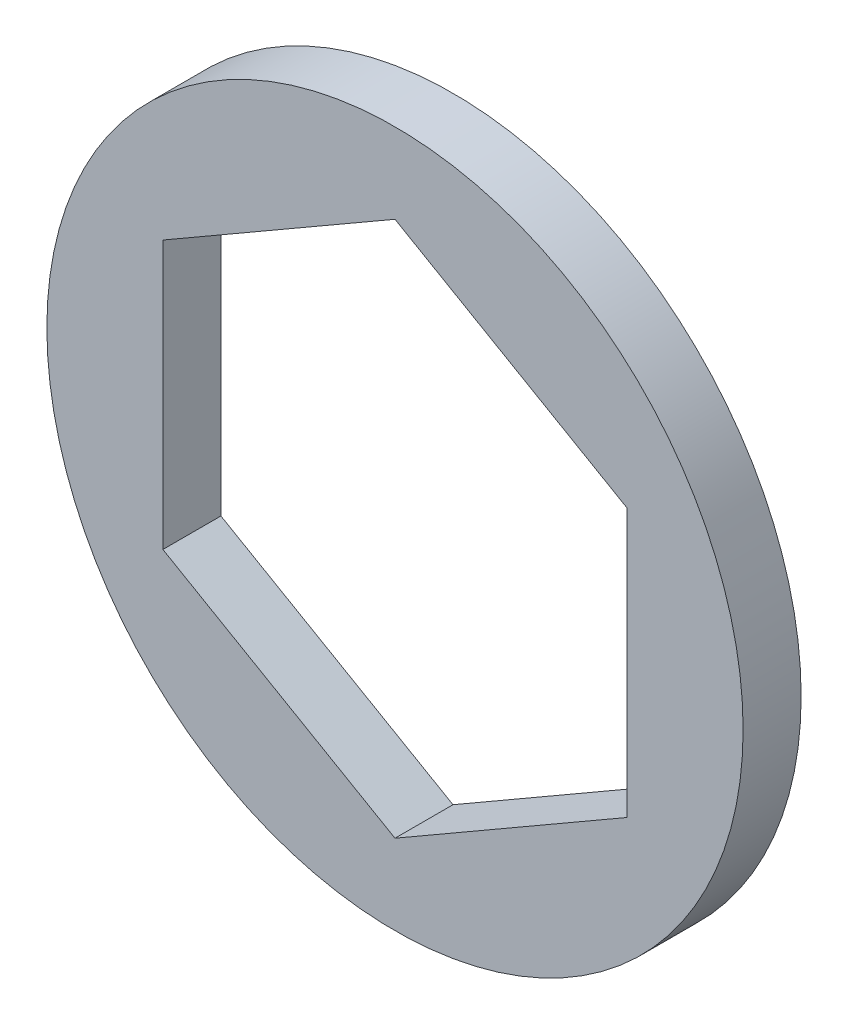
ISO-10303-21;
HEADER;
FILE_DESCRIPTION(('STEP AP214'),'2;1');
FILE_NAME('part.step','',(''),(''),'','','');
FILE_SCHEMA(('AUTOMOTIVE_DESIGN { 1 0 10303 214 1 1 1 1 }'));
ENDSEC;
DATA;
#1=APPLICATION_CONTEXT('core data for automotive mechanical design processes');
#2=APPLICATION_PROTOCOL_DEFINITION('international standard','automotive_design',2000,#1);
#3=PRODUCT_CONTEXT('',#1,'mechanical');
#4=PRODUCT('Part','Part','',(#3));
#5=PRODUCT_RELATED_PRODUCT_CATEGORY('part','',(#4));
#6=PRODUCT_DEFINITION_FORMATION('','',#4);
#7=PRODUCT_DEFINITION_CONTEXT('part definition',#1,'design');
#8=PRODUCT_DEFINITION('design','',#6,#7);
#9=PRODUCT_DEFINITION_SHAPE('','',#8);
#10=(LENGTH_UNIT() NAMED_UNIT(*) SI_UNIT(.MILLI.,.METRE.));
#11=(NAMED_UNIT(*) PLANE_ANGLE_UNIT() SI_UNIT($,.RADIAN.));
#12=(NAMED_UNIT(*) SI_UNIT($,.STERADIAN.) SOLID_ANGLE_UNIT());
#13=UNCERTAINTY_MEASURE_WITH_UNIT(LENGTH_MEASURE(1.E-05),#10,'distance_accuracy_value','');
#14=(GEOMETRIC_REPRESENTATION_CONTEXT(3) GLOBAL_UNCERTAINTY_ASSIGNED_CONTEXT((#13)) GLOBAL_UNIT_ASSIGNED_CONTEXT((#10,
#11,#12)) REPRESENTATION_CONTEXT('',''));
#15=CARTESIAN_POINT('',(0.,0.,0.));
#16=DIRECTION('',(0.,0.,1.));
#17=DIRECTION('',(1.,0.,0.));
#18=AXIS2_PLACEMENT_3D('',#15,#16,#17);
#19=CARTESIAN_POINT('',(0.,0.,0.79375));
#20=DIRECTION('',(0.,0.,1.));
#21=DIRECTION('',(1.,0.,0.));
#22=AXIS2_PLACEMENT_3D('',#19,#20,#21);
#23=PLANE('',#22);
#24=CARTESIAN_POINT('',(0.,0.,0.79375));
#25=DIRECTION('',(0.,0.,1.));
#26=DIRECTION('',(1.,0.,0.));
#27=AXIS2_PLACEMENT_3D('',#24,#25,#26);
#28=CIRCLE('',#27,9.525);
#29=CARTESIAN_POINT('',(9.525,0.,0.79375));
#30=VERTEX_POINT('',#29);
#31=EDGE_CURVE('E11',#30,#30,#28,.T.);
#32=ORIENTED_EDGE('',*,*,#31,.T.);
#33=EDGE_LOOP('',(#32));
#34=FACE_BOUND('',#33,.T.);
#35=DIRECTION('',(-0.866025403784438,-0.5,0.));
#36=VECTOR('',#35,1.);
#37=CARTESIAN_POINT('',(0.,7.33234841870825,0.79375));
#38=LINE('',#37,#36);
#39=CARTESIAN_POINT('',(0.,7.33234841870825,0.79375));
#40=VERTEX_POINT('',#39);
#41=CARTESIAN_POINT('',(-6.35,3.66617420935412,0.79375));
#42=VERTEX_POINT('',#41);
#43=EDGE_CURVE('E98',#40,#42,#38,.T.);
#44=ORIENTED_EDGE('',*,*,#43,.F.);
#45=DIRECTION('',(-0.866025403784439,0.5,0.));
#46=VECTOR('',#45,1.);
#47=CARTESIAN_POINT('',(6.35,3.66617420935413,0.79375));
#48=LINE('',#47,#46);
#49=CARTESIAN_POINT('',(6.35,3.66617420935413,0.79375));
#50=VERTEX_POINT('',#49);
#51=EDGE_CURVE('E90',#50,#40,#48,.T.);
#52=ORIENTED_EDGE('',*,*,#51,.F.);
#53=DIRECTION('',(0.,1.,0.));
#54=VECTOR('',#53,1.);
#55=CARTESIAN_POINT('',(6.35,-3.66617420935412,0.79375));
#56=LINE('',#55,#54);
#57=CARTESIAN_POINT('',(6.35,-3.66617420935412,0.79375));
#58=VERTEX_POINT('',#57);
#59=EDGE_CURVE('E118',#58,#50,#56,.T.);
#60=ORIENTED_EDGE('',*,*,#59,.F.);
#61=DIRECTION('',(0.866025403784438,0.5,0.));
#62=VECTOR('',#61,1.);
#63=CARTESIAN_POINT('',(0.,-7.33234841870825,0.79375));
#64=LINE('',#63,#62);
#65=CARTESIAN_POINT('',(0.,-7.33234841870825,0.79375));
#66=VERTEX_POINT('',#65);
#67=EDGE_CURVE('E116',#66,#58,#64,.T.);
#68=ORIENTED_EDGE('',*,*,#67,.F.);
#69=DIRECTION('',(0.866025403784439,-0.5,0.));
#70=VECTOR('',#69,1.);
#71=CARTESIAN_POINT('',(-6.35,-3.66617420935412,0.79375));
#72=LINE('',#71,#70);
#73=CARTESIAN_POINT('',(-6.35,-3.66617420935412,0.79375));
#74=VERTEX_POINT('',#73);
#75=EDGE_CURVE('E112',#74,#66,#72,.T.);
#76=ORIENTED_EDGE('',*,*,#75,.F.);
#77=DIRECTION('',(0.,-1.,0.));
#78=VECTOR('',#77,1.);
#79=CARTESIAN_POINT('',(-6.35,3.66617420935412,0.79375));
#80=LINE('',#79,#78);
#81=EDGE_CURVE('E110',#42,#74,#80,.T.);
#82=ORIENTED_EDGE('',*,*,#81,.F.);
#83=EDGE_LOOP('',(#44,#52,#60,#68,#76,#82));
#84=FACE_BOUND('',#83,.T.);
#85=ADVANCED_FACE('F37',(#34,#84),#23,.T.);
#86=CARTESIAN_POINT('',(0.,0.,-0.79375));
#87=DIRECTION('',(0.,0.,1.));
#88=DIRECTION('',(1.,0.,0.));
#89=AXIS2_PLACEMENT_3D('',#86,#87,#88);
#90=PLANE('',#89);
#91=CARTESIAN_POINT('',(0.,0.,-0.79375));
#92=DIRECTION('',(0.,0.,1.));
#93=DIRECTION('',(1.,0.,0.));
#94=AXIS2_PLACEMENT_3D('',#91,#92,#93);
#95=CIRCLE('',#94,9.525);
#96=CARTESIAN_POINT('',(9.525,0.,-0.79375));
#97=VERTEX_POINT('',#96);
#98=EDGE_CURVE('E41',#97,#97,#95,.T.);
#99=ORIENTED_EDGE('',*,*,#98,.F.);
#100=EDGE_LOOP('',(#99));
#101=FACE_BOUND('',#100,.T.);
#102=DIRECTION('',(-0.866025403784439,0.5,0.));
#103=VECTOR('',#102,1.);
#104=CARTESIAN_POINT('',(6.35,3.66617420935413,-0.79375));
#105=LINE('',#104,#103);
#106=CARTESIAN_POINT('',(6.35,3.66617420935413,-0.79375));
#107=VERTEX_POINT('',#106);
#108=CARTESIAN_POINT('',(0.,7.33234841870825,-0.79375));
#109=VERTEX_POINT('',#108);
#110=EDGE_CURVE('E60',#107,#109,#105,.T.);
#111=ORIENTED_EDGE('',*,*,#110,.T.);
#112=DIRECTION('',(-0.866025403784438,-0.5,0.));
#113=VECTOR('',#112,1.);
#114=CARTESIAN_POINT('',(0.,7.33234841870825,-0.79375));
#115=LINE('',#114,#113);
#116=CARTESIAN_POINT('',(-6.35,3.66617420935412,-0.79375));
#117=VERTEX_POINT('',#116);
#118=EDGE_CURVE('E105',#109,#117,#115,.T.);
#119=ORIENTED_EDGE('',*,*,#118,.T.);
#120=DIRECTION('',(0.,-1.,0.));
#121=VECTOR('',#120,1.);
#122=CARTESIAN_POINT('',(-6.35,3.66617420935412,-0.79375));
#123=LINE('',#122,#121);
#124=CARTESIAN_POINT('',(-6.35,-3.66617420935412,-0.79375));
#125=VERTEX_POINT('',#124);
#126=EDGE_CURVE('E122',#117,#125,#123,.T.);
#127=ORIENTED_EDGE('',*,*,#126,.T.);
#128=DIRECTION('',(0.866025403784439,-0.5,0.));
#129=VECTOR('',#128,1.);
#130=CARTESIAN_POINT('',(-6.35,-3.66617420935412,-0.79375));
#131=LINE('',#130,#129);
#132=CARTESIAN_POINT('',(0.,-7.33234841870825,-0.79375));
#133=VERTEX_POINT('',#132);
#134=EDGE_CURVE('E125',#125,#133,#131,.T.);
#135=ORIENTED_EDGE('',*,*,#134,.T.);
#136=DIRECTION('',(0.866025403784438,0.5,0.));
#137=VECTOR('',#136,1.);
#138=CARTESIAN_POINT('',(0.,-7.33234841870825,-0.79375));
#139=LINE('',#138,#137);
#140=CARTESIAN_POINT('',(6.35,-3.66617420935412,-0.79375));
#141=VERTEX_POINT('',#140);
#142=EDGE_CURVE('E128',#133,#141,#139,.T.);
#143=ORIENTED_EDGE('',*,*,#142,.T.);
#144=DIRECTION('',(0.,1.,0.));
#145=VECTOR('',#144,1.);
#146=CARTESIAN_POINT('',(6.35,-3.66617420935412,-0.79375));
#147=LINE('',#146,#145);
#148=EDGE_CURVE('E99',#141,#107,#147,.T.);
#149=ORIENTED_EDGE('',*,*,#148,.T.);
#150=EDGE_LOOP('',(#111,#119,#127,#135,#143,#149));
#151=FACE_BOUND('',#150,.T.);
#152=ADVANCED_FACE('F145',(#101,#151),#90,.F.);
#153=CARTESIAN_POINT('',(0.,0.,0.79375));
#154=DIRECTION('',(0.,0.,-1.));
#155=DIRECTION('',(-1.,0.,0.));
#156=AXIS2_PLACEMENT_3D('',#153,#154,#155);
#157=CYLINDRICAL_SURFACE('',#156,9.525);
#158=ORIENTED_EDGE('',*,*,#31,.F.);
#159=EDGE_LOOP('',(#158));
#160=FACE_BOUND('',#159,.T.);
#161=ORIENTED_EDGE('',*,*,#98,.T.);
#162=EDGE_LOOP('',(#161));
#163=FACE_BOUND('',#162,.T.);
#164=ADVANCED_FACE('F39',(#160,#163),#157,.T.);
#165=CARTESIAN_POINT('',(6.35,3.66617420935413,0.79375));
#166=DIRECTION('',(-0.5,-0.866025403784439,0.));
#167=DIRECTION('',(0.866025403784439,-0.5,0.));
#168=AXIS2_PLACEMENT_3D('',#165,#166,#167);
#169=PLANE('',#168);
#170=ORIENTED_EDGE('',*,*,#110,.F.);
#171=DIRECTION('',(0.,0.,-1.));
#172=VECTOR('',#171,1.);
#173=CARTESIAN_POINT('',(6.35,3.66617420935413,0.79375));
#174=LINE('',#173,#172);
#175=EDGE_CURVE('E94',#50,#107,#174,.T.);
#176=ORIENTED_EDGE('',*,*,#175,.F.);
#177=ORIENTED_EDGE('',*,*,#51,.T.);
#178=DIRECTION('',(0.,0.,-1.));
#179=VECTOR('',#178,1.);
#180=CARTESIAN_POINT('',(0.,7.33234841870825,0.79375));
#181=LINE('',#180,#179);
#182=EDGE_CURVE('E93',#40,#109,#181,.T.);
#183=ORIENTED_EDGE('',*,*,#182,.T.);
#184=EDGE_LOOP('',(#170,#176,#177,#183));
#185=FACE_BOUND('',#184,.T.);
#186=ADVANCED_FACE('F92',(#185),#169,.T.);
#187=CARTESIAN_POINT('',(0.,7.33234841870825,0.79375));
#188=DIRECTION('',(0.5,-0.866025403784438,0.));
#189=DIRECTION('',(0.866025403784438,0.5,0.));
#190=AXIS2_PLACEMENT_3D('',#187,#188,#189);
#191=PLANE('',#190);
#192=ORIENTED_EDGE('',*,*,#118,.F.);
#193=ORIENTED_EDGE('',*,*,#182,.F.);
#194=ORIENTED_EDGE('',*,*,#43,.T.);
#195=DIRECTION('',(0.,0.,-1.));
#196=VECTOR('',#195,1.);
#197=CARTESIAN_POINT('',(-6.35,3.66617420935412,0.79375));
#198=LINE('',#197,#196);
#199=EDGE_CURVE('E106',#42,#117,#198,.T.);
#200=ORIENTED_EDGE('',*,*,#199,.T.);
#201=EDGE_LOOP('',(#192,#193,#194,#200));
#202=FACE_BOUND('',#201,.T.);
#203=ADVANCED_FACE('F102',(#202),#191,.T.);
#204=CARTESIAN_POINT('',(-6.35,3.66617420935412,0.79375));
#205=DIRECTION('',(1.,0.,0.));
#206=DIRECTION('',(0.,1.,0.));
#207=AXIS2_PLACEMENT_3D('',#204,#205,#206);
#208=PLANE('',#207);
#209=ORIENTED_EDGE('',*,*,#126,.F.);
#210=ORIENTED_EDGE('',*,*,#199,.F.);
#211=ORIENTED_EDGE('',*,*,#81,.T.);
#212=DIRECTION('',(0.,0.,-1.));
#213=VECTOR('',#212,1.);
#214=CARTESIAN_POINT('',(-6.35,-3.66617420935412,0.79375));
#215=LINE('',#214,#213);
#216=EDGE_CURVE('E137',#74,#125,#215,.T.);
#217=ORIENTED_EDGE('',*,*,#216,.T.);
#218=EDGE_LOOP('',(#209,#210,#211,#217));
#219=FACE_BOUND('',#218,.T.);
#220=ADVANCED_FACE('F141',(#219),#208,.T.);
#221=CARTESIAN_POINT('',(-6.35,-3.66617420935412,0.79375));
#222=DIRECTION('',(0.5,0.866025403784439,0.));
#223=DIRECTION('',(-0.866025403784439,0.5,0.));
#224=AXIS2_PLACEMENT_3D('',#221,#222,#223);
#225=PLANE('',#224);
#226=ORIENTED_EDGE('',*,*,#134,.F.);
#227=ORIENTED_EDGE('',*,*,#216,.F.);
#228=ORIENTED_EDGE('',*,*,#75,.T.);
#229=DIRECTION('',(0.,0.,-1.));
#230=VECTOR('',#229,1.);
#231=CARTESIAN_POINT('',(0.,-7.33234841870825,0.79375));
#232=LINE('',#231,#230);
#233=EDGE_CURVE('E135',#66,#133,#232,.T.);
#234=ORIENTED_EDGE('',*,*,#233,.T.);
#235=EDGE_LOOP('',(#226,#227,#228,#234));
#236=FACE_BOUND('',#235,.T.);
#237=ADVANCED_FACE('F153',(#236),#225,.T.);
#238=CARTESIAN_POINT('',(0.,-7.33234841870825,0.79375));
#239=DIRECTION('',(-0.5,0.866025403784439,0.));
#240=DIRECTION('',(-0.866025403784439,-0.5,0.));
#241=AXIS2_PLACEMENT_3D('',#238,#239,#240);
#242=PLANE('',#241);
#243=ORIENTED_EDGE('',*,*,#142,.F.);
#244=ORIENTED_EDGE('',*,*,#233,.F.);
#245=ORIENTED_EDGE('',*,*,#67,.T.);
#246=DIRECTION('',(0.,0.,-1.));
#247=VECTOR('',#246,1.);
#248=CARTESIAN_POINT('',(6.35,-3.66617420935412,0.79375));
#249=LINE('',#248,#247);
#250=EDGE_CURVE('E52',#58,#141,#249,.T.);
#251=ORIENTED_EDGE('',*,*,#250,.T.);
#252=EDGE_LOOP('',(#243,#244,#245,#251));
#253=FACE_BOUND('',#252,.T.);
#254=ADVANCED_FACE('F151',(#253),#242,.T.);
#255=CARTESIAN_POINT('',(6.35,-3.66617420935412,0.79375));
#256=DIRECTION('',(-1.,0.,0.));
#257=DIRECTION('',(0.,-1.,0.));
#258=AXIS2_PLACEMENT_3D('',#255,#256,#257);
#259=PLANE('',#258);
#260=ORIENTED_EDGE('',*,*,#148,.F.);
#261=ORIENTED_EDGE('',*,*,#250,.F.);
#262=ORIENTED_EDGE('',*,*,#59,.T.);
#263=ORIENTED_EDGE('',*,*,#175,.T.);
#264=EDGE_LOOP('',(#260,#261,#262,#263));
#265=FACE_BOUND('',#264,.T.);
#266=ADVANCED_FACE('F147',(#265),#259,.T.);
#267=CLOSED_SHELL('',(#85,#152,#164,#186,#203,#220,#237,#254,#266));
#268=MANIFOLD_SOLID_BREP('B2',#267);
#269=ADVANCED_BREP_SHAPE_REPRESENTATION('',(#18,#268),#14);
#270=SHAPE_DEFINITION_REPRESENTATION(#9,#269);
ENDSEC;
END-ISO-10303-21;
